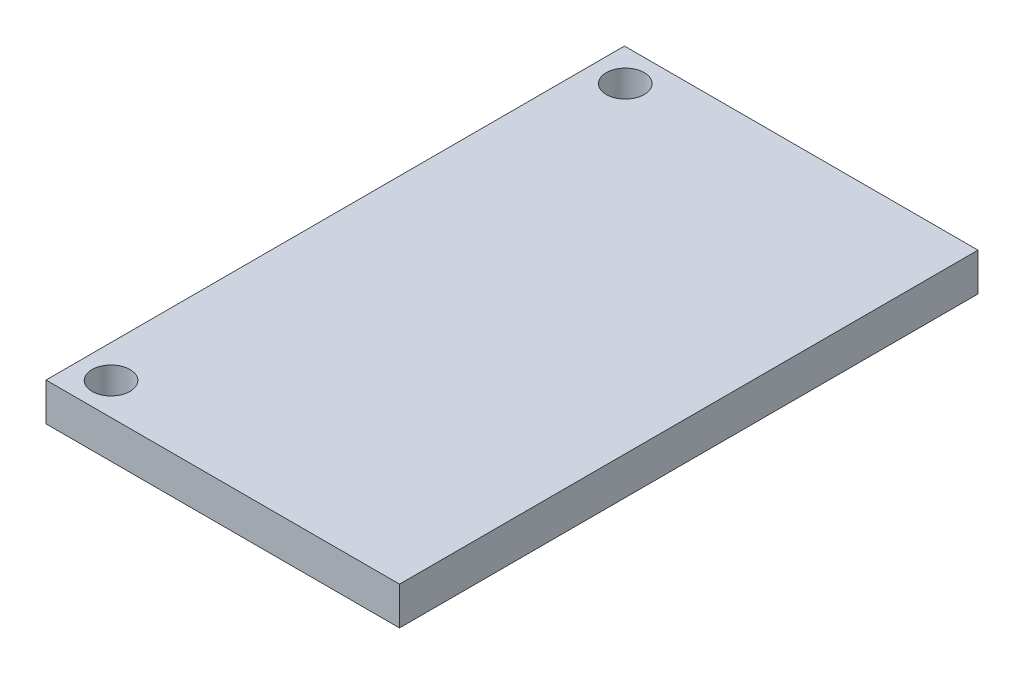
ISO-10303-21;
HEADER;
FILE_DESCRIPTION(('STEP AP214'),'2;1');
FILE_NAME('part.step','',(''),(''),'','','');
FILE_SCHEMA(('AUTOMOTIVE_DESIGN { 1 0 10303 214 1 1 1 1 }'));
ENDSEC;
DATA;
#1=APPLICATION_CONTEXT('core data for automotive mechanical design processes');
#2=APPLICATION_PROTOCOL_DEFINITION('international standard','automotive_design',2000,#1);
#3=PRODUCT_CONTEXT('',#1,'mechanical');
#4=PRODUCT('Part','Part','',(#3));
#5=PRODUCT_RELATED_PRODUCT_CATEGORY('part','',(#4));
#6=PRODUCT_DEFINITION_FORMATION('','',#4);
#7=PRODUCT_DEFINITION_CONTEXT('part definition',#1,'design');
#8=PRODUCT_DEFINITION('design','',#6,#7);
#9=PRODUCT_DEFINITION_SHAPE('','',#8);
#10=(LENGTH_UNIT() NAMED_UNIT(*) SI_UNIT(.MILLI.,.METRE.));
#11=(NAMED_UNIT(*) PLANE_ANGLE_UNIT() SI_UNIT($,.RADIAN.));
#12=(NAMED_UNIT(*) SI_UNIT($,.STERADIAN.) SOLID_ANGLE_UNIT());
#13=UNCERTAINTY_MEASURE_WITH_UNIT(LENGTH_MEASURE(1.E-05),#10,'distance_accuracy_value','');
#14=(GEOMETRIC_REPRESENTATION_CONTEXT(3) GLOBAL_UNCERTAINTY_ASSIGNED_CONTEXT((#13)) GLOBAL_UNIT_ASSIGNED_CONTEXT((#10,
#11,#12)) REPRESENTATION_CONTEXT('',''));
#15=CARTESIAN_POINT('',(0.,0.,0.));
#16=DIRECTION('',(0.,0.,1.));
#17=DIRECTION('',(1.,0.,0.));
#18=AXIS2_PLACEMENT_3D('',#15,#16,#17);
#19=CARTESIAN_POINT('',(0.,3.,0.));
#20=DIRECTION('',(1.,0.,0.));
#21=DIRECTION('',(0.,0.,-1.));
#22=AXIS2_PLACEMENT_3D('',#19,#20,#21);
#23=PLANE('',#22);
#24=DIRECTION('',(0.,0.,1.));
#25=VECTOR('',#24,1.);
#26=CARTESIAN_POINT('',(0.,0.,0.));
#27=LINE('',#26,#25);
#28=CARTESIAN_POINT('',(0.,0.,0.));
#29=VERTEX_POINT('',#28);
#30=CARTESIAN_POINT('',(0.,0.,45.72));
#31=VERTEX_POINT('',#30);
#32=EDGE_CURVE('E96',#29,#31,#27,.T.);
#33=ORIENTED_EDGE('',*,*,#32,.T.);
#34=DIRECTION('',(0.,-1.,0.));
#35=VECTOR('',#34,1.);
#36=CARTESIAN_POINT('',(0.,3.,45.72));
#37=LINE('',#36,#35);
#38=CARTESIAN_POINT('',(0.,3.,45.72));
#39=VERTEX_POINT('',#38);
#40=EDGE_CURVE('E11',#39,#31,#37,.T.);
#41=ORIENTED_EDGE('',*,*,#40,.F.);
#42=DIRECTION('',(0.,0.,1.));
#43=VECTOR('',#42,1.);
#44=CARTESIAN_POINT('',(0.,3.,0.));
#45=LINE('',#44,#43);
#46=CARTESIAN_POINT('',(0.,3.,0.));
#47=VERTEX_POINT('',#46);
#48=EDGE_CURVE('E84',#47,#39,#45,.T.);
#49=ORIENTED_EDGE('',*,*,#48,.F.);
#50=DIRECTION('',(0.,-1.,0.));
#51=VECTOR('',#50,1.);
#52=CARTESIAN_POINT('',(0.,3.,0.));
#53=LINE('',#52,#51);
#54=EDGE_CURVE('E92',#47,#29,#53,.T.);
#55=ORIENTED_EDGE('',*,*,#54,.T.);
#56=EDGE_LOOP('',(#33,#41,#49,#55));
#57=FACE_BOUND('',#56,.T.);
#58=ADVANCED_FACE('F33',(#57),#23,.F.);
#59=CARTESIAN_POINT('',(0.,3.,45.72));
#60=DIRECTION('',(0.,0.,-1.));
#61=DIRECTION('',(-1.,0.,0.));
#62=AXIS2_PLACEMENT_3D('',#59,#60,#61);
#63=PLANE('',#62);
#64=DIRECTION('',(1.,0.,0.));
#65=VECTOR('',#64,1.);
#66=CARTESIAN_POINT('',(0.,0.,45.72));
#67=LINE('',#66,#65);
#68=CARTESIAN_POINT('',(27.94,0.,45.72));
#69=VERTEX_POINT('',#68);
#70=EDGE_CURVE('E88',#31,#69,#67,.T.);
#71=ORIENTED_EDGE('',*,*,#70,.T.);
#72=DIRECTION('',(0.,-1.,0.));
#73=VECTOR('',#72,1.);
#74=CARTESIAN_POINT('',(27.94,3.,45.72));
#75=LINE('',#74,#73);
#76=CARTESIAN_POINT('',(27.94,3.,45.72));
#77=VERTEX_POINT('',#76);
#78=EDGE_CURVE('E41',#77,#69,#75,.T.);
#79=ORIENTED_EDGE('',*,*,#78,.F.);
#80=DIRECTION('',(1.,0.,0.));
#81=VECTOR('',#80,1.);
#82=CARTESIAN_POINT('',(0.,3.,45.72));
#83=LINE('',#82,#81);
#84=EDGE_CURVE('E79',#39,#77,#83,.T.);
#85=ORIENTED_EDGE('',*,*,#84,.F.);
#86=ORIENTED_EDGE('',*,*,#40,.T.);
#87=EDGE_LOOP('',(#71,#79,#85,#86));
#88=FACE_BOUND('',#87,.T.);
#89=ADVANCED_FACE('F87',(#88),#63,.F.);
#90=CARTESIAN_POINT('',(27.94,3.,0.));
#91=DIRECTION('',(-1.,0.,0.));
#92=DIRECTION('',(0.,0.,1.));
#93=AXIS2_PLACEMENT_3D('',#90,#91,#92);
#94=PLANE('',#93);
#95=DIRECTION('',(0.,0.,-1.));
#96=VECTOR('',#95,1.);
#97=CARTESIAN_POINT('',(27.94,0.,0.));
#98=LINE('',#97,#96);
#99=CARTESIAN_POINT('',(27.94,0.,0.));
#100=VERTEX_POINT('',#99);
#101=EDGE_CURVE('E66',#69,#100,#98,.T.);
#102=ORIENTED_EDGE('',*,*,#101,.T.);
#103=DIRECTION('',(0.,-1.,0.));
#104=VECTOR('',#103,1.);
#105=CARTESIAN_POINT('',(27.94,3.,0.));
#106=LINE('',#105,#104);
#107=CARTESIAN_POINT('',(27.94,3.,0.));
#108=VERTEX_POINT('',#107);
#109=EDGE_CURVE('E89',#108,#100,#106,.T.);
#110=ORIENTED_EDGE('',*,*,#109,.F.);
#111=DIRECTION('',(0.,0.,-1.));
#112=VECTOR('',#111,1.);
#113=CARTESIAN_POINT('',(27.94,3.,0.));
#114=LINE('',#113,#112);
#115=EDGE_CURVE('E82',#77,#108,#114,.T.);
#116=ORIENTED_EDGE('',*,*,#115,.F.);
#117=ORIENTED_EDGE('',*,*,#78,.T.);
#118=EDGE_LOOP('',(#102,#110,#116,#117));
#119=FACE_BOUND('',#118,.T.);
#120=ADVANCED_FACE('F90',(#119),#94,.F.);
#121=CARTESIAN_POINT('',(0.,3.,0.));
#122=DIRECTION('',(0.,0.,1.));
#123=DIRECTION('',(1.,0.,0.));
#124=AXIS2_PLACEMENT_3D('',#121,#122,#123);
#125=PLANE('',#124);
#126=DIRECTION('',(-1.,0.,0.));
#127=VECTOR('',#126,1.);
#128=CARTESIAN_POINT('',(0.,0.,0.));
#129=LINE('',#128,#127);
#130=EDGE_CURVE('E72',#100,#29,#129,.T.);
#131=ORIENTED_EDGE('',*,*,#130,.T.);
#132=ORIENTED_EDGE('',*,*,#54,.F.);
#133=DIRECTION('',(-1.,0.,0.));
#134=VECTOR('',#133,1.);
#135=CARTESIAN_POINT('',(0.,3.,0.));
#136=LINE('',#135,#134);
#137=EDGE_CURVE('E49',#108,#47,#136,.T.);
#138=ORIENTED_EDGE('',*,*,#137,.F.);
#139=ORIENTED_EDGE('',*,*,#109,.T.);
#140=EDGE_LOOP('',(#131,#132,#138,#139));
#141=FACE_BOUND('',#140,.T.);
#142=ADVANCED_FACE('F104',(#141),#125,.F.);
#143=CARTESIAN_POINT('',(0.,3.,0.));
#144=DIRECTION('',(0.,1.,0.));
#145=DIRECTION('',(0.,0.,1.));
#146=AXIS2_PLACEMENT_3D('',#143,#144,#145);
#147=PLANE('',#146);
#148=CARTESIAN_POINT('',(2.6,3.,43.18));
#149=DIRECTION('',(0.,1.,0.));
#150=DIRECTION('',(0.,0.,1.));
#151=AXIS2_PLACEMENT_3D('',#148,#149,#150);
#152=CIRCLE('',#151,1.5);
#153=CARTESIAN_POINT('',(2.6,3.,44.68));
#154=VERTEX_POINT('',#153);
#155=EDGE_CURVE('E116',#154,#154,#152,.T.);
#156=ORIENTED_EDGE('',*,*,#155,.F.);
#157=EDGE_LOOP('',(#156));
#158=FACE_BOUND('',#157,.T.);
#159=CARTESIAN_POINT('',(2.6,3.,2.54));
#160=DIRECTION('',(0.,1.,0.));
#161=DIRECTION('',(0.,0.,1.));
#162=AXIS2_PLACEMENT_3D('',#159,#160,#161);
#163=CIRCLE('',#162,1.5);
#164=CARTESIAN_POINT('',(2.6,3.,4.04));
#165=VERTEX_POINT('',#164);
#166=EDGE_CURVE('E110',#165,#165,#163,.T.);
#167=ORIENTED_EDGE('',*,*,#166,.F.);
#168=EDGE_LOOP('',(#167));
#169=FACE_BOUND('',#168,.T.);
#170=ORIENTED_EDGE('',*,*,#48,.T.);
#171=ORIENTED_EDGE('',*,*,#84,.T.);
#172=ORIENTED_EDGE('',*,*,#115,.T.);
#173=ORIENTED_EDGE('',*,*,#137,.T.);
#174=EDGE_LOOP('',(#170,#171,#172,#173));
#175=FACE_BOUND('',#174,.T.);
#176=ADVANCED_FACE('F80',(#158,#169,#175),#147,.T.);
#177=CARTESIAN_POINT('',(0.,0.,0.));
#178=DIRECTION('',(0.,1.,0.));
#179=DIRECTION('',(0.,0.,1.));
#180=AXIS2_PLACEMENT_3D('',#177,#178,#179);
#181=PLANE('',#180);
#182=CARTESIAN_POINT('',(2.6,0.,43.18));
#183=DIRECTION('',(0.,1.,0.));
#184=DIRECTION('',(0.,0.,1.));
#185=AXIS2_PLACEMENT_3D('',#182,#183,#184);
#186=CIRCLE('',#185,1.5);
#187=CARTESIAN_POINT('',(2.6,0.,44.68));
#188=VERTEX_POINT('',#187);
#189=EDGE_CURVE('E113',#188,#188,#186,.T.);
#190=ORIENTED_EDGE('',*,*,#189,.T.);
#191=EDGE_LOOP('',(#190));
#192=FACE_BOUND('',#191,.T.);
#193=CARTESIAN_POINT('',(2.6,0.,2.54));
#194=DIRECTION('',(0.,1.,0.));
#195=DIRECTION('',(0.,0.,1.));
#196=AXIS2_PLACEMENT_3D('',#193,#194,#195);
#197=CIRCLE('',#196,1.5);
#198=CARTESIAN_POINT('',(2.6,0.,4.04));
#199=VERTEX_POINT('',#198);
#200=EDGE_CURVE('E99',#199,#199,#197,.T.);
#201=ORIENTED_EDGE('',*,*,#200,.T.);
#202=EDGE_LOOP('',(#201));
#203=FACE_BOUND('',#202,.T.);
#204=ORIENTED_EDGE('',*,*,#32,.F.);
#205=ORIENTED_EDGE('',*,*,#130,.F.);
#206=ORIENTED_EDGE('',*,*,#101,.F.);
#207=ORIENTED_EDGE('',*,*,#70,.F.);
#208=EDGE_LOOP('',(#204,#205,#206,#207));
#209=FACE_BOUND('',#208,.T.);
#210=ADVANCED_FACE('F107',(#192,#203,#209),#181,.F.);
#211=CARTESIAN_POINT('',(2.6,0.,2.54));
#212=DIRECTION('',(0.,1.,0.));
#213=DIRECTION('',(0.,0.,1.));
#214=AXIS2_PLACEMENT_3D('',#211,#212,#213);
#215=CYLINDRICAL_SURFACE('',#214,1.5);
#216=ORIENTED_EDGE('',*,*,#200,.F.);
#217=EDGE_LOOP('',(#216));
#218=FACE_BOUND('',#217,.T.);
#219=ORIENTED_EDGE('',*,*,#166,.T.);
#220=EDGE_LOOP('',(#219));
#221=FACE_BOUND('',#220,.T.);
#222=ADVANCED_FACE('F127',(#218,#221),#215,.F.);
#223=CARTESIAN_POINT('',(2.6,0.,43.18));
#224=DIRECTION('',(0.,1.,0.));
#225=DIRECTION('',(0.,0.,1.));
#226=AXIS2_PLACEMENT_3D('',#223,#224,#225);
#227=CYLINDRICAL_SURFACE('',#226,1.5);
#228=ORIENTED_EDGE('',*,*,#189,.F.);
#229=EDGE_LOOP('',(#228));
#230=FACE_BOUND('',#229,.T.);
#231=ORIENTED_EDGE('',*,*,#155,.T.);
#232=EDGE_LOOP('',(#231));
#233=FACE_BOUND('',#232,.T.);
#234=ADVANCED_FACE('F124',(#230,#233),#227,.F.);
#235=CLOSED_SHELL('',(#58,#89,#120,#142,#176,#210,#222,#234));
#236=MANIFOLD_SOLID_BREP('B2',#235);
#237=ADVANCED_BREP_SHAPE_REPRESENTATION('',(#18,#236),#14);
#238=SHAPE_DEFINITION_REPRESENTATION(#9,#237);
ENDSEC;
END-ISO-10303-21;
